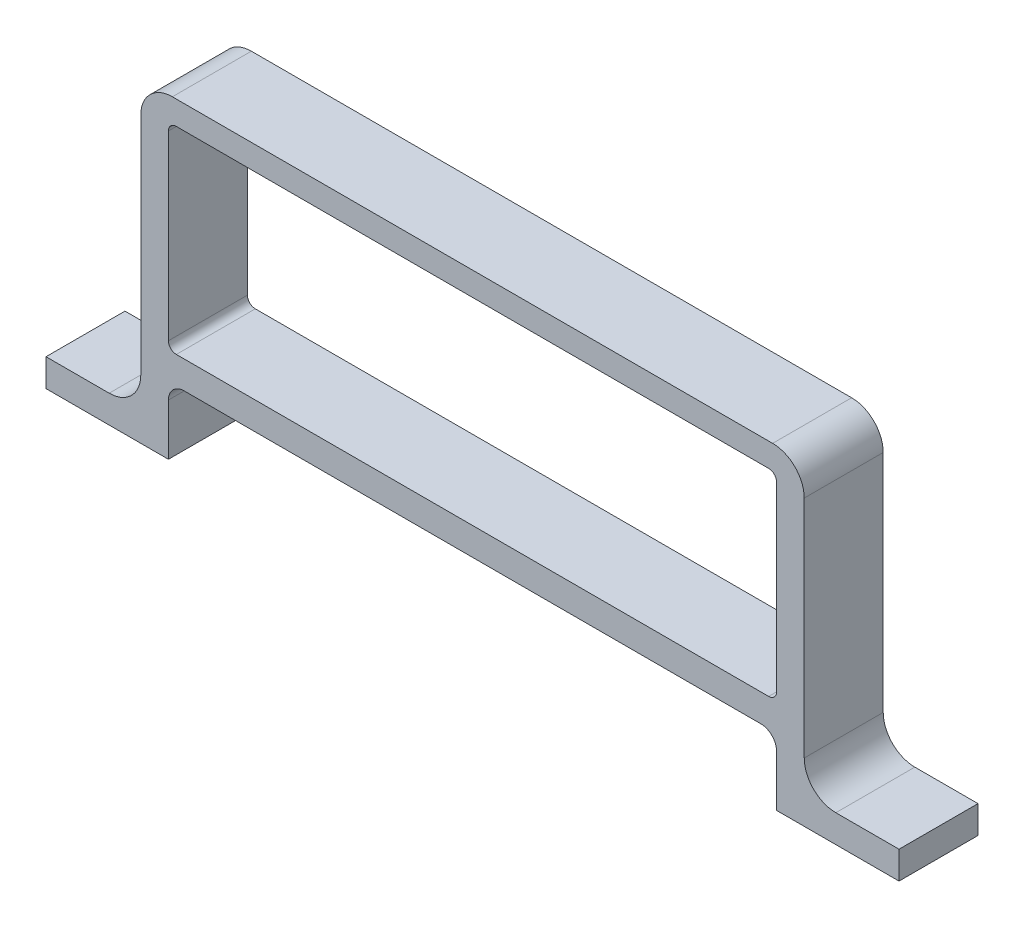
ISO-10303-21;
HEADER;
FILE_DESCRIPTION(('STEP AP214'),'2;1');
FILE_NAME('part.step','',(''),(''),'','','');
FILE_SCHEMA(('AUTOMOTIVE_DESIGN { 1 0 10303 214 1 1 1 1 }'));
ENDSEC;
DATA;
#1=APPLICATION_CONTEXT('core data for automotive mechanical design processes');
#2=APPLICATION_PROTOCOL_DEFINITION('international standard','automotive_design',2000,#1);
#3=PRODUCT_CONTEXT('',#1,'mechanical');
#4=PRODUCT('Part','Part','',(#3));
#5=PRODUCT_RELATED_PRODUCT_CATEGORY('part','',(#4));
#6=PRODUCT_DEFINITION_FORMATION('','',#4);
#7=PRODUCT_DEFINITION_CONTEXT('part definition',#1,'design');
#8=PRODUCT_DEFINITION('design','',#6,#7);
#9=PRODUCT_DEFINITION_SHAPE('','',#8);
#10=(LENGTH_UNIT() NAMED_UNIT(*) SI_UNIT(.MILLI.,.METRE.));
#11=(NAMED_UNIT(*) PLANE_ANGLE_UNIT() SI_UNIT($,.RADIAN.));
#12=(NAMED_UNIT(*) SI_UNIT($,.STERADIAN.) SOLID_ANGLE_UNIT());
#13=UNCERTAINTY_MEASURE_WITH_UNIT(LENGTH_MEASURE(1.E-05),#10,'distance_accuracy_value','');
#14=(GEOMETRIC_REPRESENTATION_CONTEXT(3) GLOBAL_UNCERTAINTY_ASSIGNED_CONTEXT((#13)) GLOBAL_UNIT_ASSIGNED_CONTEXT((#10,
#11,#12)) REPRESENTATION_CONTEXT('',''));
#15=CARTESIAN_POINT('',(0.,0.,0.));
#16=DIRECTION('',(0.,0.,1.));
#17=DIRECTION('',(1.,0.,0.));
#18=AXIS2_PLACEMENT_3D('',#15,#16,#17);
#19=CARTESIAN_POINT('',(-43.1871611587765,0.,10.));
#20=DIRECTION('',(-1.,0.,0.));
#21=DIRECTION('',(0.,0.,1.));
#22=AXIS2_PLACEMENT_3D('',#19,#20,#21);
#23=PLANE('',#22);
#24=DIRECTION('',(0.,1.,0.));
#25=VECTOR('',#24,1.);
#26=CARTESIAN_POINT('',(-43.1871611587765,0.,0.));
#27=LINE('',#26,#25);
#28=CARTESIAN_POINT('',(-43.1871611587765,-4.2455849456596,0.));
#29=VERTEX_POINT('',#28);
#30=CARTESIAN_POINT('',(-43.1871611587765,24.2544150543403,0.));
#31=VERTEX_POINT('',#30);
#32=EDGE_CURVE('E172',#29,#31,#27,.T.);
#33=ORIENTED_EDGE('',*,*,#32,.F.);
#34=DIRECTION('',(0.,0.,-1.));
#35=VECTOR('',#34,1.);
#36=CARTESIAN_POINT('',(-43.1871611587765,-4.2455849456596,10.));
#37=LINE('',#36,#35);
#38=CARTESIAN_POINT('',(-43.1871611587765,-4.2455849456596,10.));
#39=VERTEX_POINT('',#38);
#40=EDGE_CURVE('E11',#39,#29,#37,.T.);
#41=ORIENTED_EDGE('',*,*,#40,.F.);
#42=DIRECTION('',(0.,1.,0.));
#43=VECTOR('',#42,1.);
#44=CARTESIAN_POINT('',(-43.1871611587765,0.,10.));
#45=LINE('',#44,#43);
#46=CARTESIAN_POINT('',(-43.1871611587765,24.2544150543403,10.));
#47=VERTEX_POINT('',#46);
#48=EDGE_CURVE('E210',#39,#47,#45,.T.);
#49=ORIENTED_EDGE('',*,*,#48,.T.);
#50=DIRECTION('',(0.,0.,-1.));
#51=VECTOR('',#50,1.);
#52=CARTESIAN_POINT('',(-43.1871611587765,24.2544150543403,10.));
#53=LINE('',#52,#51);
#54=EDGE_CURVE('E51',#47,#31,#53,.T.);
#55=ORIENTED_EDGE('',*,*,#54,.T.);
#56=EDGE_LOOP('',(#33,#41,#49,#55));
#57=FACE_BOUND('',#56,.T.);
#58=ADVANCED_FACE('F35',(#57),#23,.T.);
#59=CARTESIAN_POINT('',(-47.1871611587765,-4.24558494565963,10.));
#60=DIRECTION('',(0.,0.,-1.));
#61=DIRECTION('',(-1.,0.,0.));
#62=AXIS2_PLACEMENT_3D('',#59,#60,#61);
#63=CYLINDRICAL_SURFACE('',#62,4.);
#64=CARTESIAN_POINT('',(-47.1871611587765,-4.24558494565963,0.));
#65=DIRECTION('',(0.,0.,1.));
#66=DIRECTION('',(1.,0.,0.));
#67=AXIS2_PLACEMENT_3D('',#64,#65,#66);
#68=CIRCLE('',#67,4.);
#69=CARTESIAN_POINT('',(-47.1871611587765,-8.24558494565963,0.));
#70=VERTEX_POINT('',#69);
#71=EDGE_CURVE('E174',#29,#70,#68,.F.);
#72=ORIENTED_EDGE('',*,*,#71,.T.);
#73=DIRECTION('',(0.,0.,-1.));
#74=VECTOR('',#73,1.);
#75=CARTESIAN_POINT('',(-47.1871611587765,-8.24558494565963,10.));
#76=LINE('',#75,#74);
#77=CARTESIAN_POINT('',(-47.1871611587765,-8.24558494565963,10.));
#78=VERTEX_POINT('',#77);
#79=EDGE_CURVE('E43',#78,#70,#76,.T.);
#80=ORIENTED_EDGE('',*,*,#79,.F.);
#81=CARTESIAN_POINT('',(-47.1871611587765,-4.24558494565963,10.));
#82=DIRECTION('',(0.,0.,1.));
#83=DIRECTION('',(1.,0.,0.));
#84=AXIS2_PLACEMENT_3D('',#81,#82,#83);
#85=CIRCLE('',#84,4.);
#86=EDGE_CURVE('E256',#39,#78,#85,.F.);
#87=ORIENTED_EDGE('',*,*,#86,.F.);
#88=ORIENTED_EDGE('',*,*,#40,.T.);
#89=EDGE_LOOP('',(#72,#80,#87,#88));
#90=FACE_BOUND('',#89,.T.);
#91=ADVANCED_FACE('F303',(#90),#63,.F.);
#92=CARTESIAN_POINT('',(0.,-8.24558494565962,10.));
#93=DIRECTION('',(0.,-1.,0.));
#94=DIRECTION('',(1.,0.,0.));
#95=AXIS2_PLACEMENT_3D('',#92,#93,#94);
#96=PLANE('',#95);
#97=DIRECTION('',(-1.,0.,0.));
#98=VECTOR('',#97,1.);
#99=CARTESIAN_POINT('',(0.,-8.24558494565962,0.));
#100=LINE('',#99,#98);
#101=CARTESIAN_POINT('',(-55.1871611587765,-8.24558494565963,0.));
#102=VERTEX_POINT('',#101);
#103=EDGE_CURVE('E177',#70,#102,#100,.T.);
#104=ORIENTED_EDGE('',*,*,#103,.T.);
#105=DIRECTION('',(0.,0.,-1.));
#106=VECTOR('',#105,1.);
#107=CARTESIAN_POINT('',(-55.1871611587765,-8.24558494565963,10.));
#108=LINE('',#107,#106);
#109=CARTESIAN_POINT('',(-55.1871611587765,-8.24558494565963,10.));
#110=VERTEX_POINT('',#109);
#111=EDGE_CURVE('E227',#110,#102,#108,.T.);
#112=ORIENTED_EDGE('',*,*,#111,.F.);
#113=DIRECTION('',(-1.,0.,0.));
#114=VECTOR('',#113,1.);
#115=CARTESIAN_POINT('',(0.,-8.24558494565962,10.));
#116=LINE('',#115,#114);
#117=EDGE_CURVE('E235',#78,#110,#116,.T.);
#118=ORIENTED_EDGE('',*,*,#117,.F.);
#119=ORIENTED_EDGE('',*,*,#79,.T.);
#120=EDGE_LOOP('',(#104,#112,#118,#119));
#121=FACE_BOUND('',#120,.T.);
#122=ADVANCED_FACE('F233',(#121),#96,.F.);
#123=CARTESIAN_POINT('',(-55.1871611587765,1.09410816039594E-13,10.));
#124=DIRECTION('',(-1.,0.,0.));
#125=DIRECTION('',(0.,-1.,0.));
#126=AXIS2_PLACEMENT_3D('',#123,#124,#125);
#127=PLANE('',#126);
#128=DIRECTION('',(0.,1.,0.));
#129=VECTOR('',#128,1.);
#130=CARTESIAN_POINT('',(-55.1871611587765,1.09410816039594E-13,0.));
#131=LINE('',#130,#129);
#132=CARTESIAN_POINT('',(-55.1871611587765,-11.7455849456596,0.));
#133=VERTEX_POINT('',#132);
#134=EDGE_CURVE('E180',#133,#102,#131,.T.);
#135=ORIENTED_EDGE('',*,*,#134,.F.);
#136=DIRECTION('',(0.,0.,-1.));
#137=VECTOR('',#136,1.);
#138=CARTESIAN_POINT('',(-55.1871611587765,-11.7455849456596,10.));
#139=LINE('',#138,#137);
#140=CARTESIAN_POINT('',(-55.1871611587765,-11.7455849456596,10.));
#141=VERTEX_POINT('',#140);
#142=EDGE_CURVE('E225',#141,#133,#139,.T.);
#143=ORIENTED_EDGE('',*,*,#142,.F.);
#144=DIRECTION('',(0.,1.,0.));
#145=VECTOR('',#144,1.);
#146=CARTESIAN_POINT('',(-55.1871611587765,1.09410816039594E-13,10.));
#147=LINE('',#146,#145);
#148=EDGE_CURVE('E248',#141,#110,#147,.T.);
#149=ORIENTED_EDGE('',*,*,#148,.T.);
#150=ORIENTED_EDGE('',*,*,#111,.T.);
#151=EDGE_LOOP('',(#135,#143,#149,#150));
#152=FACE_BOUND('',#151,.T.);
#153=ADVANCED_FACE('F245',(#152),#127,.T.);
#154=CARTESIAN_POINT('',(0.,-11.7455849456596,10.));
#155=DIRECTION('',(0.,-1.,0.));
#156=DIRECTION('',(1.,0.,0.));
#157=AXIS2_PLACEMENT_3D('',#154,#155,#156);
#158=PLANE('',#157);
#159=DIRECTION('',(-1.,0.,0.));
#160=VECTOR('',#159,1.);
#161=CARTESIAN_POINT('',(0.,-11.7455849456596,0.));
#162=LINE('',#161,#160);
#163=CARTESIAN_POINT('',(-39.6871611587765,-11.7455849456596,0.));
#164=VERTEX_POINT('',#163);
#165=EDGE_CURVE('E183',#164,#133,#162,.T.);
#166=ORIENTED_EDGE('',*,*,#165,.F.);
#167=DIRECTION('',(0.,0.,-1.));
#168=VECTOR('',#167,1.);
#169=CARTESIAN_POINT('',(-39.6871611587765,-11.7455849456596,10.));
#170=LINE('',#169,#168);
#171=CARTESIAN_POINT('',(-39.6871611587765,-11.7455849456596,10.));
#172=VERTEX_POINT('',#171);
#173=EDGE_CURVE('E223',#172,#164,#170,.T.);
#174=ORIENTED_EDGE('',*,*,#173,.F.);
#175=DIRECTION('',(-1.,0.,0.));
#176=VECTOR('',#175,1.);
#177=CARTESIAN_POINT('',(0.,-11.7455849456596,10.));
#178=LINE('',#177,#176);
#179=EDGE_CURVE('E252',#172,#141,#178,.T.);
#180=ORIENTED_EDGE('',*,*,#179,.T.);
#181=ORIENTED_EDGE('',*,*,#142,.T.);
#182=EDGE_LOOP('',(#166,#174,#180,#181));
#183=FACE_BOUND('',#182,.T.);
#184=ADVANCED_FACE('F645',(#183),#158,.T.);
#185=CARTESIAN_POINT('',(-39.6871611587765,0.,10.));
#186=DIRECTION('',(1.,0.,0.));
#187=DIRECTION('',(0.,0.,-1.));
#188=AXIS2_PLACEMENT_3D('',#185,#186,#187);
#189=PLANE('',#188);
#190=DIRECTION('',(0.,-1.,0.));
#191=VECTOR('',#190,1.);
#192=CARTESIAN_POINT('',(-39.6871611587765,0.,0.));
#193=LINE('',#192,#191);
#194=CARTESIAN_POINT('',(-39.6871611587765,-5.24558494565964,0.));
#195=VERTEX_POINT('',#194);
#196=EDGE_CURVE('E186',#195,#164,#193,.T.);
#197=ORIENTED_EDGE('',*,*,#196,.F.);
#198=DIRECTION('',(0.,0.,-1.));
#199=VECTOR('',#198,1.);
#200=CARTESIAN_POINT('',(-39.6871611587765,-5.24558494565964,10.));
#201=LINE('',#200,#199);
#202=CARTESIAN_POINT('',(-39.6871611587765,-5.24558494565964,10.));
#203=VERTEX_POINT('',#202);
#204=EDGE_CURVE('E221',#203,#195,#201,.T.);
#205=ORIENTED_EDGE('',*,*,#204,.F.);
#206=DIRECTION('',(0.,-1.,0.));
#207=VECTOR('',#206,1.);
#208=CARTESIAN_POINT('',(-39.6871611587765,0.,10.));
#209=LINE('',#208,#207);
#210=EDGE_CURVE('E254',#203,#172,#209,.T.);
#211=ORIENTED_EDGE('',*,*,#210,.T.);
#212=ORIENTED_EDGE('',*,*,#173,.T.);
#213=EDGE_LOOP('',(#197,#205,#211,#212));
#214=FACE_BOUND('',#213,.T.);
#215=ADVANCED_FACE('F641',(#214),#189,.T.);
#216=CARTESIAN_POINT('',(-37.6871611587765,-5.24558494565963,10.));
#217=DIRECTION('',(0.,0.,-1.));
#218=DIRECTION('',(-1.,0.,0.));
#219=AXIS2_PLACEMENT_3D('',#216,#217,#218);
#220=CYLINDRICAL_SURFACE('',#219,2.);
#221=CARTESIAN_POINT('',(-37.6871611587765,-5.24558494565963,0.));
#222=DIRECTION('',(0.,0.,1.));
#223=DIRECTION('',(1.,0.,0.));
#224=AXIS2_PLACEMENT_3D('',#221,#222,#223);
#225=CIRCLE('',#224,2.);
#226=CARTESIAN_POINT('',(-37.6871611587764,-3.24558494565963,0.));
#227=VERTEX_POINT('',#226);
#228=EDGE_CURVE('E189',#195,#227,#225,.F.);
#229=ORIENTED_EDGE('',*,*,#228,.T.);
#230=DIRECTION('',(0.,0.,-1.));
#231=VECTOR('',#230,1.);
#232=CARTESIAN_POINT('',(-37.6871611587764,-3.24558494565963,10.));
#233=LINE('',#232,#231);
#234=CARTESIAN_POINT('',(-37.6871611587764,-3.24558494565963,10.));
#235=VERTEX_POINT('',#234);
#236=EDGE_CURVE('E218',#235,#227,#233,.T.);
#237=ORIENTED_EDGE('',*,*,#236,.F.);
#238=CARTESIAN_POINT('',(-37.6871611587765,-5.24558494565963,10.));
#239=DIRECTION('',(0.,0.,1.));
#240=DIRECTION('',(1.,0.,0.));
#241=AXIS2_PLACEMENT_3D('',#238,#239,#240);
#242=CIRCLE('',#241,2.);
#243=EDGE_CURVE('E262',#203,#235,#242,.F.);
#244=ORIENTED_EDGE('',*,*,#243,.F.);
#245=ORIENTED_EDGE('',*,*,#204,.T.);
#246=EDGE_LOOP('',(#229,#237,#244,#245));
#247=FACE_BOUND('',#246,.T.);
#248=ADVANCED_FACE('F646',(#247),#220,.F.);
#249=CARTESIAN_POINT('',(0.,-3.24558494565963,10.));
#250=DIRECTION('',(0.,1.,0.));
#251=DIRECTION('',(0.,0.,1.));
#252=AXIS2_PLACEMENT_3D('',#249,#250,#251);
#253=PLANE('',#252);
#254=DIRECTION('',(1.,0.,0.));
#255=VECTOR('',#254,1.);
#256=CARTESIAN_POINT('',(0.,-3.24558494565963,0.));
#257=LINE('',#256,#255);
#258=CARTESIAN_POINT('',(35.3128388412235,-3.24558494565963,0.));
#259=VERTEX_POINT('',#258);
#260=EDGE_CURVE('E191',#227,#259,#257,.T.);
#261=ORIENTED_EDGE('',*,*,#260,.T.);
#262=DIRECTION('',(0.,0.,-1.));
#263=VECTOR('',#262,1.);
#264=CARTESIAN_POINT('',(35.3128388412235,-3.24558494565963,10.));
#265=LINE('',#264,#263);
#266=CARTESIAN_POINT('',(35.3128388412235,-3.24558494565963,10.));
#267=VERTEX_POINT('',#266);
#268=EDGE_CURVE('E503',#267,#259,#265,.T.);
#269=ORIENTED_EDGE('',*,*,#268,.F.);
#270=DIRECTION('',(1.,0.,0.));
#271=VECTOR('',#270,1.);
#272=CARTESIAN_POINT('',(0.,-3.24558494565963,10.));
#273=LINE('',#272,#271);
#274=EDGE_CURVE('E264',#235,#267,#273,.T.);
#275=ORIENTED_EDGE('',*,*,#274,.F.);
#276=ORIENTED_EDGE('',*,*,#236,.T.);
#277=EDGE_LOOP('',(#261,#269,#275,#276));
#278=FACE_BOUND('',#277,.T.);
#279=ADVANCED_FACE('F635',(#278),#253,.F.);
#280=CARTESIAN_POINT('',(0.,0.25441505434037,10.));
#281=DIRECTION('',(0.,-1.,0.));
#282=DIRECTION('',(0.,0.,-1.));
#283=AXIS2_PLACEMENT_3D('',#280,#281,#282);
#284=PLANE('',#283);
#285=DIRECTION('',(-1.,0.,0.));
#286=VECTOR('',#285,1.);
#287=CARTESIAN_POINT('',(0.,0.25441505434037,0.));
#288=LINE('',#287,#286);
#289=CARTESIAN_POINT('',(36.3128388412235,0.25441505434037,0.));
#290=VERTEX_POINT('',#289);
#291=CARTESIAN_POINT('',(-38.6871611587765,0.25441505434037,0.));
#292=VERTEX_POINT('',#291);
#293=EDGE_CURVE('E194',#290,#292,#288,.T.);
#294=ORIENTED_EDGE('',*,*,#293,.T.);
#295=DIRECTION('',(0.,0.,-1.));
#296=VECTOR('',#295,1.);
#297=CARTESIAN_POINT('',(-38.6871611587765,0.25441505434037,10.));
#298=LINE('',#297,#296);
#299=CARTESIAN_POINT('',(-38.6871611587765,0.25441505434037,10.));
#300=VERTEX_POINT('',#299);
#301=EDGE_CURVE('E216',#300,#292,#298,.T.);
#302=ORIENTED_EDGE('',*,*,#301,.F.);
#303=DIRECTION('',(-1.,0.,0.));
#304=VECTOR('',#303,1.);
#305=CARTESIAN_POINT('',(0.,0.25441505434037,10.));
#306=LINE('',#305,#304);
#307=CARTESIAN_POINT('',(36.3128388412235,0.25441505434037,10.));
#308=VERTEX_POINT('',#307);
#309=EDGE_CURVE('E267',#308,#300,#306,.T.);
#310=ORIENTED_EDGE('',*,*,#309,.F.);
#311=DIRECTION('',(0.,0.,-1.));
#312=VECTOR('',#311,1.);
#313=CARTESIAN_POINT('',(36.3128388412235,0.25441505434037,10.));
#314=LINE('',#313,#312);
#315=EDGE_CURVE('E287',#308,#290,#314,.T.);
#316=ORIENTED_EDGE('',*,*,#315,.T.);
#317=EDGE_LOOP('',(#294,#302,#310,#316));
#318=FACE_BOUND('',#317,.T.);
#319=ADVANCED_FACE('F284',(#318),#284,.F.);
#320=CARTESIAN_POINT('',(-38.6871611587765,1.25441505434037,10.));
#321=DIRECTION('',(0.,0.,-1.));
#322=DIRECTION('',(-1.,0.,0.));
#323=AXIS2_PLACEMENT_3D('',#320,#321,#322);
#324=CYLINDRICAL_SURFACE('',#323,1.);
#325=CARTESIAN_POINT('',(-38.6871611587765,1.25441505434037,0.));
#326=DIRECTION('',(0.,0.,1.));
#327=DIRECTION('',(1.,0.,0.));
#328=AXIS2_PLACEMENT_3D('',#325,#326,#327);
#329=CIRCLE('',#328,1.);
#330=CARTESIAN_POINT('',(-39.6871611587765,1.25441505434037,0.));
#331=VERTEX_POINT('',#330);
#332=EDGE_CURVE('E197',#331,#292,#329,.T.);
#333=ORIENTED_EDGE('',*,*,#332,.F.);
#334=DIRECTION('',(0.,0.,-1.));
#335=VECTOR('',#334,1.);
#336=CARTESIAN_POINT('',(-39.6871611587765,1.25441505434037,10.));
#337=LINE('',#336,#335);
#338=CARTESIAN_POINT('',(-39.6871611587765,1.25441505434037,10.));
#339=VERTEX_POINT('',#338);
#340=EDGE_CURVE('E214',#339,#331,#337,.T.);
#341=ORIENTED_EDGE('',*,*,#340,.F.);
#342=CARTESIAN_POINT('',(-38.6871611587765,1.25441505434037,10.));
#343=DIRECTION('',(0.,0.,1.));
#344=DIRECTION('',(1.,0.,0.));
#345=AXIS2_PLACEMENT_3D('',#342,#343,#344);
#346=CIRCLE('',#345,1.);
#347=EDGE_CURVE('E269',#339,#300,#346,.T.);
#348=ORIENTED_EDGE('',*,*,#347,.T.);
#349=ORIENTED_EDGE('',*,*,#301,.T.);
#350=EDGE_LOOP('',(#333,#341,#348,#349));
#351=FACE_BOUND('',#350,.T.);
#352=ADVANCED_FACE('F273',(#351),#324,.F.);
#353=CARTESIAN_POINT('',(-39.6871611587765,0.,10.));
#354=DIRECTION('',(-1.,0.,0.));
#355=DIRECTION('',(0.,0.,1.));
#356=AXIS2_PLACEMENT_3D('',#353,#354,#355);
#357=PLANE('',#356);
#358=DIRECTION('',(0.,1.,0.));
#359=VECTOR('',#358,1.);
#360=CARTESIAN_POINT('',(-39.6871611587765,0.,0.));
#361=LINE('',#360,#359);
#362=CARTESIAN_POINT('',(-39.6871611587765,24.2544150543404,0.));
#363=VERTEX_POINT('',#362);
#364=EDGE_CURVE('E200',#331,#363,#361,.T.);
#365=ORIENTED_EDGE('',*,*,#364,.T.);
#366=DIRECTION('',(0.,0.,-1.));
#367=VECTOR('',#366,1.);
#368=CARTESIAN_POINT('',(-39.6871611587765,24.2544150543404,10.));
#369=LINE('',#368,#367);
#370=CARTESIAN_POINT('',(-39.6871611587765,24.2544150543404,10.));
#371=VERTEX_POINT('',#370);
#372=EDGE_CURVE('E159',#371,#363,#369,.T.);
#373=ORIENTED_EDGE('',*,*,#372,.F.);
#374=DIRECTION('',(0.,1.,0.));
#375=VECTOR('',#374,1.);
#376=CARTESIAN_POINT('',(-39.6871611587765,0.,10.));
#377=LINE('',#376,#375);
#378=EDGE_CURVE('E146',#339,#371,#377,.T.);
#379=ORIENTED_EDGE('',*,*,#378,.F.);
#380=ORIENTED_EDGE('',*,*,#340,.T.);
#381=EDGE_LOOP('',(#365,#373,#379,#380));
#382=FACE_BOUND('',#381,.T.);
#383=ADVANCED_FACE('F293',(#382),#357,.F.);
#384=CARTESIAN_POINT('',(-38.6871611587765,24.2544150543404,10.));
#385=DIRECTION('',(0.,0.,-1.));
#386=DIRECTION('',(-1.,0.,0.));
#387=AXIS2_PLACEMENT_3D('',#384,#385,#386);
#388=CYLINDRICAL_SURFACE('',#387,1.);
#389=CARTESIAN_POINT('',(-38.6871611587765,24.2544150543404,0.));
#390=DIRECTION('',(0.,0.,1.));
#391=DIRECTION('',(1.,0.,0.));
#392=AXIS2_PLACEMENT_3D('',#389,#390,#391);
#393=CIRCLE('',#392,1.);
#394=CARTESIAN_POINT('',(-38.6871611587765,25.2544150543404,0.));
#395=VERTEX_POINT('',#394);
#396=EDGE_CURVE('E155',#363,#395,#393,.F.);
#397=ORIENTED_EDGE('',*,*,#396,.T.);
#398=DIRECTION('',(0.,0.,-1.));
#399=VECTOR('',#398,1.);
#400=CARTESIAN_POINT('',(-38.6871611587765,25.2544150543404,10.));
#401=LINE('',#400,#399);
#402=CARTESIAN_POINT('',(-38.6871611587765,25.2544150543404,10.));
#403=VERTEX_POINT('',#402);
#404=EDGE_CURVE('E152',#403,#395,#401,.T.);
#405=ORIENTED_EDGE('',*,*,#404,.F.);
#406=CARTESIAN_POINT('',(-38.6871611587765,24.2544150543404,10.));
#407=DIRECTION('',(0.,0.,1.));
#408=DIRECTION('',(1.,0.,0.));
#409=AXIS2_PLACEMENT_3D('',#406,#407,#408);
#410=CIRCLE('',#409,1.);
#411=EDGE_CURVE('E136',#371,#403,#410,.F.);
#412=ORIENTED_EDGE('',*,*,#411,.F.);
#413=ORIENTED_EDGE('',*,*,#372,.T.);
#414=EDGE_LOOP('',(#397,#405,#412,#413));
#415=FACE_BOUND('',#414,.T.);
#416=ADVANCED_FACE('F153',(#415),#388,.F.);
#417=CARTESIAN_POINT('',(0.,25.2544150543404,10.));
#418=DIRECTION('',(0.,1.,0.));
#419=DIRECTION('',(0.,0.,1.));
#420=AXIS2_PLACEMENT_3D('',#417,#418,#419);
#421=PLANE('',#420);
#422=DIRECTION('',(1.,0.,0.));
#423=VECTOR('',#422,1.);
#424=CARTESIAN_POINT('',(0.,25.2544150543404,0.));
#425=LINE('',#424,#423);
#426=CARTESIAN_POINT('',(36.3128388412235,25.2544150543404,0.));
#427=VERTEX_POINT('',#426);
#428=EDGE_CURVE('E203',#395,#427,#425,.T.);
#429=ORIENTED_EDGE('',*,*,#428,.T.);
#430=DIRECTION('',(0.,0.,-1.));
#431=VECTOR('',#430,1.);
#432=CARTESIAN_POINT('',(36.3128388412235,25.2544150543404,10.));
#433=LINE('',#432,#431);
#434=CARTESIAN_POINT('',(36.3128388412235,25.2544150543404,10.));
#435=VERTEX_POINT('',#434);
#436=EDGE_CURVE('E163',#435,#427,#433,.T.);
#437=ORIENTED_EDGE('',*,*,#436,.F.);
#438=DIRECTION('',(1.,0.,0.));
#439=VECTOR('',#438,1.);
#440=CARTESIAN_POINT('',(0.,25.2544150543404,10.));
#441=LINE('',#440,#439);
#442=EDGE_CURVE('E142',#403,#435,#441,.T.);
#443=ORIENTED_EDGE('',*,*,#442,.F.);
#444=ORIENTED_EDGE('',*,*,#404,.T.);
#445=EDGE_LOOP('',(#429,#437,#443,#444));
#446=FACE_BOUND('',#445,.T.);
#447=ADVANCED_FACE('F161',(#446),#421,.F.);
#448=CARTESIAN_POINT('',(0.,28.2544150543404,10.));
#449=DIRECTION('',(0.,-1.,0.));
#450=DIRECTION('',(0.,0.,-1.));
#451=AXIS2_PLACEMENT_3D('',#448,#449,#450);
#452=PLANE('',#451);
#453=DIRECTION('',(-1.,0.,0.));
#454=VECTOR('',#453,1.);
#455=CARTESIAN_POINT('',(0.,28.2544150543404,0.));
#456=LINE('',#455,#454);
#457=CARTESIAN_POINT('',(36.8128388412235,28.2544150543404,0.));
#458=VERTEX_POINT('',#457);
#459=CARTESIAN_POINT('',(-39.1871611587764,28.2544150543404,0.));
#460=VERTEX_POINT('',#459);
#461=EDGE_CURVE('E205',#458,#460,#456,.T.);
#462=ORIENTED_EDGE('',*,*,#461,.T.);
#463=DIRECTION('',(0.,0.,-1.));
#464=VECTOR('',#463,1.);
#465=CARTESIAN_POINT('',(-39.1871611587764,28.2544150543404,10.));
#466=LINE('',#465,#464);
#467=CARTESIAN_POINT('',(-39.1871611587764,28.2544150543404,10.));
#468=VERTEX_POINT('',#467);
#469=EDGE_CURVE('E93',#468,#460,#466,.T.);
#470=ORIENTED_EDGE('',*,*,#469,.F.);
#471=DIRECTION('',(-1.,0.,0.));
#472=VECTOR('',#471,1.);
#473=CARTESIAN_POINT('',(0.,28.2544150543404,10.));
#474=LINE('',#473,#472);
#475=CARTESIAN_POINT('',(36.8128388412235,28.2544150543404,10.));
#476=VERTEX_POINT('',#475);
#477=EDGE_CURVE('E165',#476,#468,#474,.T.);
#478=ORIENTED_EDGE('',*,*,#477,.F.);
#479=DIRECTION('',(0.,0.,-1.));
#480=VECTOR('',#479,1.);
#481=CARTESIAN_POINT('',(36.8128388412235,28.2544150543404,10.));
#482=LINE('',#481,#480);
#483=EDGE_CURVE('E514',#476,#458,#482,.T.);
#484=ORIENTED_EDGE('',*,*,#483,.T.);
#485=EDGE_LOOP('',(#462,#470,#478,#484));
#486=FACE_BOUND('',#485,.T.);
#487=ADVANCED_FACE('F309',(#486),#452,.F.);
#488=CARTESIAN_POINT('',(-39.1871611587765,24.2544150543404,10.));
#489=DIRECTION('',(0.,0.,-1.));
#490=DIRECTION('',(-1.,0.,0.));
#491=AXIS2_PLACEMENT_3D('',#488,#489,#490);
#492=CYLINDRICAL_SURFACE('',#491,4.);
#493=CARTESIAN_POINT('',(-39.1871611587765,24.2544150543404,0.));
#494=DIRECTION('',(0.,0.,1.));
#495=DIRECTION('',(1.,0.,0.));
#496=AXIS2_PLACEMENT_3D('',#493,#494,#495);
#497=CIRCLE('',#496,4.);
#498=EDGE_CURVE('E207',#31,#460,#497,.F.);
#499=ORIENTED_EDGE('',*,*,#498,.F.);
#500=ORIENTED_EDGE('',*,*,#54,.F.);
#501=CARTESIAN_POINT('',(-39.1871611587765,24.2544150543404,10.));
#502=DIRECTION('',(0.,0.,1.));
#503=DIRECTION('',(1.,0.,0.));
#504=AXIS2_PLACEMENT_3D('',#501,#502,#503);
#505=CIRCLE('',#504,4.);
#506=EDGE_CURVE('E167',#47,#468,#505,.F.);
#507=ORIENTED_EDGE('',*,*,#506,.T.);
#508=ORIENTED_EDGE('',*,*,#469,.T.);
#509=EDGE_LOOP('',(#499,#500,#507,#508));
#510=FACE_BOUND('',#509,.T.);
#511=ADVANCED_FACE('F307',(#510),#492,.T.);
#512=CARTESIAN_POINT('',(0.,0.,10.));
#513=DIRECTION('',(0.,0.,1.));
#514=DIRECTION('',(1.,0.,0.));
#515=AXIS2_PLACEMENT_3D('',#512,#513,#514);
#516=PLANE('',#515);
#517=CARTESIAN_POINT('',(36.8128388412235,24.2544150543404,10.));
#518=DIRECTION('',(0.,0.,-1.));
#519=DIRECTION('',(-1.,0.,0.));
#520=AXIS2_PLACEMENT_3D('',#517,#518,#519);
#521=CIRCLE('',#520,4.);
#522=CARTESIAN_POINT('',(40.8128388412235,24.2544150543403,10.));
#523=VERTEX_POINT('',#522);
#524=EDGE_CURVE('E482',#523,#476,#521,.F.);
#525=ORIENTED_EDGE('',*,*,#524,.T.);
#526=ORIENTED_EDGE('',*,*,#477,.T.);
#527=ORIENTED_EDGE('',*,*,#506,.F.);
#528=ORIENTED_EDGE('',*,*,#48,.F.);
#529=ORIENTED_EDGE('',*,*,#86,.T.);
#530=ORIENTED_EDGE('',*,*,#117,.T.);
#531=ORIENTED_EDGE('',*,*,#148,.F.);
#532=ORIENTED_EDGE('',*,*,#179,.F.);
#533=ORIENTED_EDGE('',*,*,#210,.F.);
#534=ORIENTED_EDGE('',*,*,#243,.T.);
#535=ORIENTED_EDGE('',*,*,#274,.T.);
#536=CARTESIAN_POINT('',(35.3128388412235,-5.24558494565963,10.));
#537=DIRECTION('',(0.,0.,-1.));
#538=DIRECTION('',(-1.,0.,0.));
#539=AXIS2_PLACEMENT_3D('',#536,#537,#538);
#540=CIRCLE('',#539,2.);
#541=CARTESIAN_POINT('',(37.3128388412235,-5.24558494565964,10.));
#542=VERTEX_POINT('',#541);
#543=EDGE_CURVE('E593',#542,#267,#540,.F.);
#544=ORIENTED_EDGE('',*,*,#543,.F.);
#545=DIRECTION('',(0.,-1.,0.));
#546=VECTOR('',#545,1.);
#547=CARTESIAN_POINT('',(37.3128388412235,0.,10.));
#548=LINE('',#547,#546);
#549=CARTESIAN_POINT('',(37.3128388412235,-11.7455849456596,10.));
#550=VERTEX_POINT('',#549);
#551=EDGE_CURVE('E590',#542,#550,#548,.T.);
#552=ORIENTED_EDGE('',*,*,#551,.T.);
#553=DIRECTION('',(1.,0.,0.));
#554=VECTOR('',#553,1.);
#555=CARTESIAN_POINT('',(-2.37432231755293,-11.7455849456596,10.));
#556=LINE('',#555,#554);
#557=CARTESIAN_POINT('',(52.8128388412236,-11.7455849456596,10.));
#558=VERTEX_POINT('',#557);
#559=EDGE_CURVE('E587',#550,#558,#556,.T.);
#560=ORIENTED_EDGE('',*,*,#559,.T.);
#561=DIRECTION('',(0.,1.,0.));
#562=VECTOR('',#561,1.);
#563=CARTESIAN_POINT('',(52.8128388412235,1.09410816039594E-13,10.));
#564=LINE('',#563,#562);
#565=CARTESIAN_POINT('',(52.8128388412235,-8.24558494565963,10.));
#566=VERTEX_POINT('',#565);
#567=EDGE_CURVE('E584',#558,#566,#564,.T.);
#568=ORIENTED_EDGE('',*,*,#567,.T.);
#569=DIRECTION('',(1.,0.,0.));
#570=VECTOR('',#569,1.);
#571=CARTESIAN_POINT('',(-2.37432231755293,-8.24558494565962,10.));
#572=LINE('',#571,#570);
#573=CARTESIAN_POINT('',(44.8128388412236,-8.24558494565963,10.));
#574=VERTEX_POINT('',#573);
#575=EDGE_CURVE('E558',#574,#566,#572,.T.);
#576=ORIENTED_EDGE('',*,*,#575,.F.);
#577=CARTESIAN_POINT('',(44.8128388412235,-4.24558494565963,10.));
#578=DIRECTION('',(0.,0.,-1.));
#579=DIRECTION('',(-1.,0.,0.));
#580=AXIS2_PLACEMENT_3D('',#577,#578,#579);
#581=CIRCLE('',#580,4.);
#582=CARTESIAN_POINT('',(40.8128388412235,-4.2455849456596,10.));
#583=VERTEX_POINT('',#582);
#584=EDGE_CURVE('E489',#583,#574,#581,.F.);
#585=ORIENTED_EDGE('',*,*,#584,.F.);
#586=DIRECTION('',(0.,1.,0.));
#587=VECTOR('',#586,1.);
#588=CARTESIAN_POINT('',(40.8128388412235,0.,10.));
#589=LINE('',#588,#587);
#590=EDGE_CURVE('E478',#583,#523,#589,.T.);
#591=ORIENTED_EDGE('',*,*,#590,.T.);
#592=EDGE_LOOP('',(#525,#526,#527,#528,#529,#530,#531,#532,#533,#534,#535,#544,#552,#560,#568,
#576,#585,#591));
#593=FACE_BOUND('',#592,.T.);
#594=ORIENTED_EDGE('',*,*,#442,.T.);
#595=CARTESIAN_POINT('',(36.3128388412235,24.2544150543404,10.));
#596=DIRECTION('',(0.,0.,-1.));
#597=DIRECTION('',(-1.,0.,0.));
#598=AXIS2_PLACEMENT_3D('',#595,#596,#597);
#599=CIRCLE('',#598,1.);
#600=CARTESIAN_POINT('',(37.3128388412235,24.2544150543404,10.));
#601=VERTEX_POINT('',#600);
#602=EDGE_CURVE('E600',#601,#435,#599,.F.);
#603=ORIENTED_EDGE('',*,*,#602,.F.);
#604=DIRECTION('',(0.,1.,0.));
#605=VECTOR('',#604,1.);
#606=CARTESIAN_POINT('',(37.3128388412235,0.,10.));
#607=LINE('',#606,#605);
#608=CARTESIAN_POINT('',(37.3128388412235,1.25441505434037,10.));
#609=VERTEX_POINT('',#608);
#610=EDGE_CURVE('E597',#609,#601,#607,.T.);
#611=ORIENTED_EDGE('',*,*,#610,.F.);
#612=CARTESIAN_POINT('',(36.3128388412235,1.25441505434037,10.));
#613=DIRECTION('',(0.,0.,-1.));
#614=DIRECTION('',(-1.,0.,0.));
#615=AXIS2_PLACEMENT_3D('',#612,#613,#614);
#616=CIRCLE('',#615,1.);
#617=EDGE_CURVE('E280',#609,#308,#616,.T.);
#618=ORIENTED_EDGE('',*,*,#617,.T.);
#619=ORIENTED_EDGE('',*,*,#309,.T.);
#620=ORIENTED_EDGE('',*,*,#347,.F.);
#621=ORIENTED_EDGE('',*,*,#378,.T.);
#622=ORIENTED_EDGE('',*,*,#411,.T.);
#623=EDGE_LOOP('',(#594,#603,#611,#618,#619,#620,#621,#622));
#624=FACE_BOUND('',#623,.T.);
#625=ADVANCED_FACE('F138',(#593,#624),#516,.T.);
#626=CARTESIAN_POINT('',(0.,0.,0.));
#627=DIRECTION('',(0.,0.,1.));
#628=DIRECTION('',(1.,0.,0.));
#629=AXIS2_PLACEMENT_3D('',#626,#627,#628);
#630=PLANE('',#629);
#631=ORIENTED_EDGE('',*,*,#461,.F.);
#632=CARTESIAN_POINT('',(36.8128388412235,24.2544150543404,0.));
#633=DIRECTION('',(0.,0.,-1.));
#634=DIRECTION('',(-1.,0.,0.));
#635=AXIS2_PLACEMENT_3D('',#632,#633,#634);
#636=CIRCLE('',#635,4.);
#637=CARTESIAN_POINT('',(40.8128388412235,24.2544150543403,0.));
#638=VERTEX_POINT('',#637);
#639=EDGE_CURVE('E530',#638,#458,#636,.F.);
#640=ORIENTED_EDGE('',*,*,#639,.F.);
#641=DIRECTION('',(0.,1.,0.));
#642=VECTOR('',#641,1.);
#643=CARTESIAN_POINT('',(40.8128388412235,0.,0.));
#644=LINE('',#643,#642);
#645=CARTESIAN_POINT('',(40.8128388412235,-4.2455849456596,0.));
#646=VERTEX_POINT('',#645);
#647=EDGE_CURVE('E579',#646,#638,#644,.T.);
#648=ORIENTED_EDGE('',*,*,#647,.F.);
#649=CARTESIAN_POINT('',(44.8128388412235,-4.24558494565963,0.));
#650=DIRECTION('',(0.,0.,-1.));
#651=DIRECTION('',(-1.,0.,0.));
#652=AXIS2_PLACEMENT_3D('',#649,#650,#651);
#653=CIRCLE('',#652,4.);
#654=CARTESIAN_POINT('',(44.8128388412236,-8.24558494565963,0.));
#655=VERTEX_POINT('',#654);
#656=EDGE_CURVE('E466',#646,#655,#653,.F.);
#657=ORIENTED_EDGE('',*,*,#656,.T.);
#658=DIRECTION('',(1.,0.,0.));
#659=VECTOR('',#658,1.);
#660=CARTESIAN_POINT('',(-2.37432231755293,-8.24558494565962,0.));
#661=LINE('',#660,#659);
#662=CARTESIAN_POINT('',(52.8128388412235,-8.24558494565963,0.));
#663=VERTEX_POINT('',#662);
#664=EDGE_CURVE('E479',#655,#663,#661,.T.);
#665=ORIENTED_EDGE('',*,*,#664,.T.);
#666=DIRECTION('',(0.,1.,0.));
#667=VECTOR('',#666,1.);
#668=CARTESIAN_POINT('',(52.8128388412235,1.09410816039594E-13,0.));
#669=LINE('',#668,#667);
#670=CARTESIAN_POINT('',(52.8128388412236,-11.7455849456596,0.));
#671=VERTEX_POINT('',#670);
#672=EDGE_CURVE('E484',#671,#663,#669,.T.);
#673=ORIENTED_EDGE('',*,*,#672,.F.);
#674=DIRECTION('',(1.,0.,0.));
#675=VECTOR('',#674,1.);
#676=CARTESIAN_POINT('',(-2.37432231755293,-11.7455849456596,0.));
#677=LINE('',#676,#675);
#678=CARTESIAN_POINT('',(37.3128388412235,-11.7455849456596,0.));
#679=VERTEX_POINT('',#678);
#680=EDGE_CURVE('E563',#679,#671,#677,.T.);
#681=ORIENTED_EDGE('',*,*,#680,.F.);
#682=DIRECTION('',(0.,-1.,0.));
#683=VECTOR('',#682,1.);
#684=CARTESIAN_POINT('',(37.3128388412235,0.,0.));
#685=LINE('',#684,#683);
#686=CARTESIAN_POINT('',(37.3128388412235,-5.24558494565964,0.));
#687=VERTEX_POINT('',#686);
#688=EDGE_CURVE('E564',#687,#679,#685,.T.);
#689=ORIENTED_EDGE('',*,*,#688,.F.);
#690=CARTESIAN_POINT('',(35.3128388412235,-5.24558494565963,0.));
#691=DIRECTION('',(0.,0.,-1.));
#692=DIRECTION('',(-1.,0.,0.));
#693=AXIS2_PLACEMENT_3D('',#690,#691,#692);
#694=CIRCLE('',#693,2.);
#695=EDGE_CURVE('E568',#687,#259,#694,.F.);
#696=ORIENTED_EDGE('',*,*,#695,.T.);
#697=ORIENTED_EDGE('',*,*,#260,.F.);
#698=ORIENTED_EDGE('',*,*,#228,.F.);
#699=ORIENTED_EDGE('',*,*,#196,.T.);
#700=ORIENTED_EDGE('',*,*,#165,.T.);
#701=ORIENTED_EDGE('',*,*,#134,.T.);
#702=ORIENTED_EDGE('',*,*,#103,.F.);
#703=ORIENTED_EDGE('',*,*,#71,.F.);
#704=ORIENTED_EDGE('',*,*,#32,.T.);
#705=ORIENTED_EDGE('',*,*,#498,.T.);
#706=EDGE_LOOP('',(#631,#640,#648,#657,#665,#673,#681,#689,#696,#697,#698,#699,#700,#701,#702,
#703,#704,#705));
#707=FACE_BOUND('',#706,.T.);
#708=CARTESIAN_POINT('',(36.3128388412235,24.2544150543404,0.));
#709=DIRECTION('',(0.,0.,-1.));
#710=DIRECTION('',(-1.,0.,0.));
#711=AXIS2_PLACEMENT_3D('',#708,#709,#710);
#712=CIRCLE('',#711,1.);
#713=CARTESIAN_POINT('',(37.3128388412235,24.2544150543404,0.));
#714=VERTEX_POINT('',#713);
#715=EDGE_CURVE('E576',#714,#427,#712,.F.);
#716=ORIENTED_EDGE('',*,*,#715,.T.);
#717=ORIENTED_EDGE('',*,*,#428,.F.);
#718=ORIENTED_EDGE('',*,*,#396,.F.);
#719=ORIENTED_EDGE('',*,*,#364,.F.);
#720=ORIENTED_EDGE('',*,*,#332,.T.);
#721=ORIENTED_EDGE('',*,*,#293,.F.);
#722=CARTESIAN_POINT('',(36.3128388412235,1.25441505434037,0.));
#723=DIRECTION('',(0.,0.,-1.));
#724=DIRECTION('',(-1.,0.,0.));
#725=AXIS2_PLACEMENT_3D('',#722,#723,#724);
#726=CIRCLE('',#725,1.);
#727=CARTESIAN_POINT('',(37.3128388412235,1.25441505434037,0.));
#728=VERTEX_POINT('',#727);
#729=EDGE_CURVE('E571',#728,#290,#726,.T.);
#730=ORIENTED_EDGE('',*,*,#729,.F.);
#731=DIRECTION('',(0.,1.,0.));
#732=VECTOR('',#731,1.);
#733=CARTESIAN_POINT('',(37.3128388412235,0.,0.));
#734=LINE('',#733,#732);
#735=EDGE_CURVE('E573',#728,#714,#734,.T.);
#736=ORIENTED_EDGE('',*,*,#735,.T.);
#737=EDGE_LOOP('',(#716,#717,#718,#719,#720,#721,#730,#736));
#738=FACE_BOUND('',#737,.T.);
#739=ADVANCED_FACE('F240',(#707,#738),#630,.F.);
#740=CARTESIAN_POINT('',(40.8128388412235,0.,10.));
#741=DIRECTION('',(-1.,0.,0.));
#742=DIRECTION('',(0.,0.,1.));
#743=AXIS2_PLACEMENT_3D('',#740,#741,#742);
#744=PLANE('',#743);
#745=ORIENTED_EDGE('',*,*,#647,.T.);
#746=DIRECTION('',(0.,0.,-1.));
#747=VECTOR('',#746,1.);
#748=CARTESIAN_POINT('',(40.8128388412235,24.2544150543403,10.));
#749=LINE('',#748,#747);
#750=EDGE_CURVE('E175',#523,#638,#749,.T.);
#751=ORIENTED_EDGE('',*,*,#750,.F.);
#752=ORIENTED_EDGE('',*,*,#590,.F.);
#753=DIRECTION('',(0.,0.,-1.));
#754=VECTOR('',#753,1.);
#755=CARTESIAN_POINT('',(40.8128388412235,-4.2455849456596,10.));
#756=LINE('',#755,#754);
#757=EDGE_CURVE('E469',#583,#646,#756,.T.);
#758=ORIENTED_EDGE('',*,*,#757,.T.);
#759=EDGE_LOOP('',(#745,#751,#752,#758));
#760=FACE_BOUND('',#759,.T.);
#761=ADVANCED_FACE('F347',(#760),#744,.F.);
#762=CARTESIAN_POINT('',(36.8128388412235,24.2544150543404,10.));
#763=DIRECTION('',(0.,0.,-1.));
#764=DIRECTION('',(-1.,0.,0.));
#765=AXIS2_PLACEMENT_3D('',#762,#763,#764);
#766=CYLINDRICAL_SURFACE('',#765,4.);
#767=ORIENTED_EDGE('',*,*,#639,.T.);
#768=ORIENTED_EDGE('',*,*,#483,.F.);
#769=ORIENTED_EDGE('',*,*,#524,.F.);
#770=ORIENTED_EDGE('',*,*,#750,.T.);
#771=EDGE_LOOP('',(#767,#768,#769,#770));
#772=FACE_BOUND('',#771,.T.);
#773=ADVANCED_FACE('F357',(#772),#766,.T.);
#774=CARTESIAN_POINT('',(36.3128388412235,24.2544150543404,10.));
#775=DIRECTION('',(0.,0.,-1.));
#776=DIRECTION('',(-1.,0.,0.));
#777=AXIS2_PLACEMENT_3D('',#774,#775,#776);
#778=CYLINDRICAL_SURFACE('',#777,1.);
#779=ORIENTED_EDGE('',*,*,#715,.F.);
#780=DIRECTION('',(0.,0.,-1.));
#781=VECTOR('',#780,1.);
#782=CARTESIAN_POINT('',(37.3128388412235,24.2544150543404,10.));
#783=LINE('',#782,#781);
#784=EDGE_CURVE('E510',#601,#714,#783,.T.);
#785=ORIENTED_EDGE('',*,*,#784,.F.);
#786=ORIENTED_EDGE('',*,*,#602,.T.);
#787=ORIENTED_EDGE('',*,*,#436,.T.);
#788=EDGE_LOOP('',(#779,#785,#786,#787));
#789=FACE_BOUND('',#788,.T.);
#790=ADVANCED_FACE('F367',(#789),#778,.F.);
#791=CARTESIAN_POINT('',(37.3128388412235,0.,10.));
#792=DIRECTION('',(-1.,0.,0.));
#793=DIRECTION('',(0.,0.,1.));
#794=AXIS2_PLACEMENT_3D('',#791,#792,#793);
#795=PLANE('',#794);
#796=ORIENTED_EDGE('',*,*,#735,.F.);
#797=DIRECTION('',(0.,0.,-1.));
#798=VECTOR('',#797,1.);
#799=CARTESIAN_POINT('',(37.3128388412235,1.25441505434037,10.));
#800=LINE('',#799,#798);
#801=EDGE_CURVE('E507',#609,#728,#800,.T.);
#802=ORIENTED_EDGE('',*,*,#801,.F.);
#803=ORIENTED_EDGE('',*,*,#610,.T.);
#804=ORIENTED_EDGE('',*,*,#784,.T.);
#805=EDGE_LOOP('',(#796,#802,#803,#804));
#806=FACE_BOUND('',#805,.T.);
#807=ADVANCED_FACE('F377',(#806),#795,.T.);
#808=CARTESIAN_POINT('',(36.3128388412235,1.25441505434037,10.));
#809=DIRECTION('',(0.,0.,-1.));
#810=DIRECTION('',(-1.,0.,0.));
#811=AXIS2_PLACEMENT_3D('',#808,#809,#810);
#812=CYLINDRICAL_SURFACE('',#811,1.);
#813=ORIENTED_EDGE('',*,*,#729,.T.);
#814=ORIENTED_EDGE('',*,*,#315,.F.);
#815=ORIENTED_EDGE('',*,*,#617,.F.);
#816=ORIENTED_EDGE('',*,*,#801,.T.);
#817=EDGE_LOOP('',(#813,#814,#815,#816));
#818=FACE_BOUND('',#817,.T.);
#819=ADVANCED_FACE('F387',(#818),#812,.F.);
#820=CARTESIAN_POINT('',(35.3128388412235,-5.24558494565963,10.));
#821=DIRECTION('',(0.,0.,-1.));
#822=DIRECTION('',(-1.,0.,0.));
#823=AXIS2_PLACEMENT_3D('',#820,#821,#822);
#824=CYLINDRICAL_SURFACE('',#823,2.);
#825=ORIENTED_EDGE('',*,*,#695,.F.);
#826=DIRECTION('',(0.,0.,-1.));
#827=VECTOR('',#826,1.);
#828=CARTESIAN_POINT('',(37.3128388412235,-5.24558494565964,10.));
#829=LINE('',#828,#827);
#830=EDGE_CURVE('E500',#542,#687,#829,.T.);
#831=ORIENTED_EDGE('',*,*,#830,.F.);
#832=ORIENTED_EDGE('',*,*,#543,.T.);
#833=ORIENTED_EDGE('',*,*,#268,.T.);
#834=EDGE_LOOP('',(#825,#831,#832,#833));
#835=FACE_BOUND('',#834,.T.);
#836=ADVANCED_FACE('F397',(#835),#824,.F.);
#837=CARTESIAN_POINT('',(37.3128388412235,0.,10.));
#838=DIRECTION('',(1.,0.,0.));
#839=DIRECTION('',(0.,0.,-1.));
#840=AXIS2_PLACEMENT_3D('',#837,#838,#839);
#841=PLANE('',#840);
#842=ORIENTED_EDGE('',*,*,#688,.T.);
#843=DIRECTION('',(0.,0.,-1.));
#844=VECTOR('',#843,1.);
#845=CARTESIAN_POINT('',(37.3128388412235,-11.7455849456596,10.));
#846=LINE('',#845,#844);
#847=EDGE_CURVE('E497',#550,#679,#846,.T.);
#848=ORIENTED_EDGE('',*,*,#847,.F.);
#849=ORIENTED_EDGE('',*,*,#551,.F.);
#850=ORIENTED_EDGE('',*,*,#830,.T.);
#851=EDGE_LOOP('',(#842,#848,#849,#850));
#852=FACE_BOUND('',#851,.T.);
#853=ADVANCED_FACE('F407',(#852),#841,.F.);
#854=CARTESIAN_POINT('',(-2.37432231755293,-11.7455849456596,10.));
#855=DIRECTION('',(0.,1.,0.));
#856=DIRECTION('',(-1.,0.,0.));
#857=AXIS2_PLACEMENT_3D('',#854,#855,#856);
#858=PLANE('',#857);
#859=ORIENTED_EDGE('',*,*,#680,.T.);
#860=DIRECTION('',(0.,0.,-1.));
#861=VECTOR('',#860,1.);
#862=CARTESIAN_POINT('',(52.8128388412236,-11.7455849456596,10.));
#863=LINE('',#862,#861);
#864=EDGE_CURVE('E494',#558,#671,#863,.T.);
#865=ORIENTED_EDGE('',*,*,#864,.F.);
#866=ORIENTED_EDGE('',*,*,#559,.F.);
#867=ORIENTED_EDGE('',*,*,#847,.T.);
#868=EDGE_LOOP('',(#859,#865,#866,#867));
#869=FACE_BOUND('',#868,.T.);
#870=ADVANCED_FACE('F417',(#869),#858,.F.);
#871=CARTESIAN_POINT('',(52.8128388412235,1.09410816039594E-13,10.));
#872=DIRECTION('',(-1.,0.,0.));
#873=DIRECTION('',(0.,-1.,0.));
#874=AXIS2_PLACEMENT_3D('',#871,#872,#873);
#875=PLANE('',#874);
#876=ORIENTED_EDGE('',*,*,#672,.T.);
#877=DIRECTION('',(0.,0.,-1.));
#878=VECTOR('',#877,1.);
#879=CARTESIAN_POINT('',(52.8128388412235,-8.24558494565963,10.));
#880=LINE('',#879,#878);
#881=EDGE_CURVE('E491',#566,#663,#880,.T.);
#882=ORIENTED_EDGE('',*,*,#881,.F.);
#883=ORIENTED_EDGE('',*,*,#567,.F.);
#884=ORIENTED_EDGE('',*,*,#864,.T.);
#885=EDGE_LOOP('',(#876,#882,#883,#884));
#886=FACE_BOUND('',#885,.T.);
#887=ADVANCED_FACE('F428',(#886),#875,.F.);
#888=CARTESIAN_POINT('',(-2.37432231755293,-8.24558494565962,10.));
#889=DIRECTION('',(0.,1.,0.));
#890=DIRECTION('',(-1.,0.,0.));
#891=AXIS2_PLACEMENT_3D('',#888,#889,#890);
#892=PLANE('',#891);
#893=ORIENTED_EDGE('',*,*,#664,.F.);
#894=DIRECTION('',(0.,0.,-1.));
#895=VECTOR('',#894,1.);
#896=CARTESIAN_POINT('',(44.8128388412236,-8.24558494565963,10.));
#897=LINE('',#896,#895);
#898=EDGE_CURVE('E473',#574,#655,#897,.T.);
#899=ORIENTED_EDGE('',*,*,#898,.F.);
#900=ORIENTED_EDGE('',*,*,#575,.T.);
#901=ORIENTED_EDGE('',*,*,#881,.T.);
#902=EDGE_LOOP('',(#893,#899,#900,#901));
#903=FACE_BOUND('',#902,.T.);
#904=ADVANCED_FACE('F438',(#903),#892,.T.);
#905=CARTESIAN_POINT('',(44.8128388412235,-4.24558494565963,10.));
#906=DIRECTION('',(0.,0.,-1.));
#907=DIRECTION('',(-1.,0.,0.));
#908=AXIS2_PLACEMENT_3D('',#905,#906,#907);
#909=CYLINDRICAL_SURFACE('',#908,4.);
#910=ORIENTED_EDGE('',*,*,#656,.F.);
#911=ORIENTED_EDGE('',*,*,#757,.F.);
#912=ORIENTED_EDGE('',*,*,#584,.T.);
#913=ORIENTED_EDGE('',*,*,#898,.T.);
#914=EDGE_LOOP('',(#910,#911,#912,#913));
#915=FACE_BOUND('',#914,.T.);
#916=ADVANCED_FACE('F448',(#915),#909,.F.);
#917=CLOSED_SHELL('',(#58,#91,#122,#153,#184,#215,#248,#279,#319,#352,#383,#416,#447,#487,#511,
#625,#739,#761,#773,#790,#807,#819,#836,#853,#870,#887,#904,#916));
#918=MANIFOLD_SOLID_BREP('B2',#917);
#919=ADVANCED_BREP_SHAPE_REPRESENTATION('',(#18,#918),#14);
#920=SHAPE_DEFINITION_REPRESENTATION(#9,#919);
ENDSEC;
END-ISO-10303-21;
